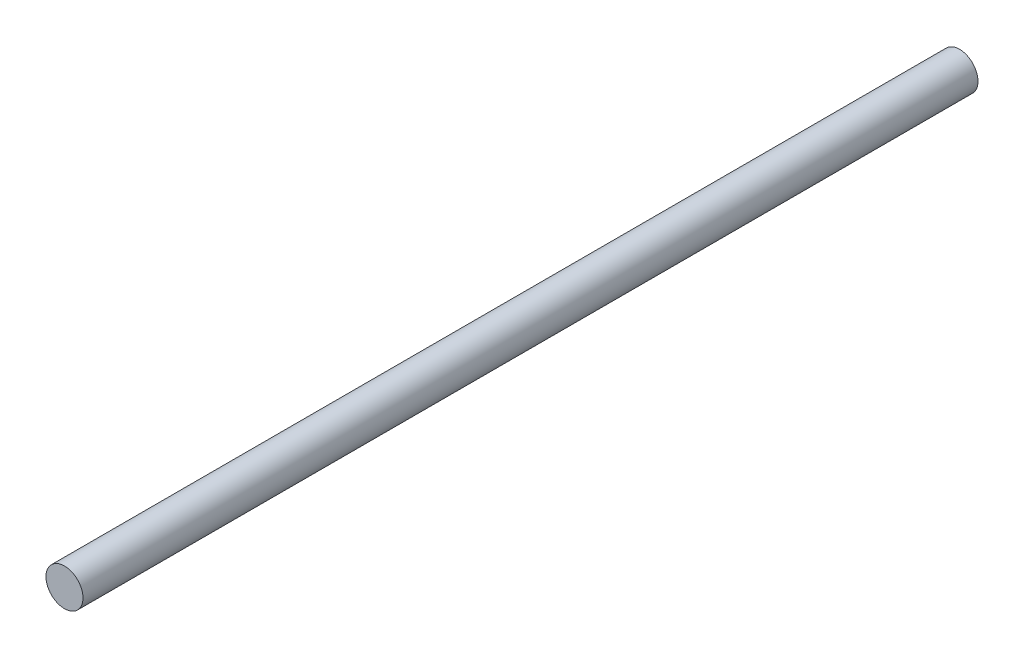
ISO-10303-21;
HEADER;
FILE_DESCRIPTION(('STEP AP214'),'2;1');
FILE_NAME('part.step','',(''),(''),'','','');
FILE_SCHEMA(('AUTOMOTIVE_DESIGN { 1 0 10303 214 1 1 1 1 }'));
ENDSEC;
DATA;
#1=APPLICATION_CONTEXT('core data for automotive mechanical design processes');
#2=APPLICATION_PROTOCOL_DEFINITION('international standard','automotive_design',2000,#1);
#3=PRODUCT_CONTEXT('',#1,'mechanical');
#4=PRODUCT('Part','Part','',(#3));
#5=PRODUCT_RELATED_PRODUCT_CATEGORY('part','',(#4));
#6=PRODUCT_DEFINITION_FORMATION('','',#4);
#7=PRODUCT_DEFINITION_CONTEXT('part definition',#1,'design');
#8=PRODUCT_DEFINITION('design','',#6,#7);
#9=PRODUCT_DEFINITION_SHAPE('','',#8);
#10=(LENGTH_UNIT() NAMED_UNIT(*) SI_UNIT(.MILLI.,.METRE.));
#11=(NAMED_UNIT(*) PLANE_ANGLE_UNIT() SI_UNIT($,.RADIAN.));
#12=(NAMED_UNIT(*) SI_UNIT($,.STERADIAN.) SOLID_ANGLE_UNIT());
#13=UNCERTAINTY_MEASURE_WITH_UNIT(LENGTH_MEASURE(1.E-05),#10,'distance_accuracy_value','');
#14=(GEOMETRIC_REPRESENTATION_CONTEXT(3) GLOBAL_UNCERTAINTY_ASSIGNED_CONTEXT((#13)) GLOBAL_UNIT_ASSIGNED_CONTEXT((#10,
#11,#12)) REPRESENTATION_CONTEXT('',''));
#15=CARTESIAN_POINT('',(0.,0.,0.));
#16=DIRECTION('',(0.,0.,1.));
#17=DIRECTION('',(1.,0.,0.));
#18=AXIS2_PLACEMENT_3D('',#15,#16,#17);
#19=CARTESIAN_POINT('',(0.,0.,145.));
#20=DIRECTION('',(0.,0.,-1.));
#21=DIRECTION('',(-1.,0.,0.));
#22=AXIS2_PLACEMENT_3D('',#19,#20,#21);
#23=CYLINDRICAL_SURFACE('',#22,3.);
#24=CARTESIAN_POINT('',(0.,0.,145.));
#25=DIRECTION('',(0.,0.,1.));
#26=DIRECTION('',(1.,0.,0.));
#27=AXIS2_PLACEMENT_3D('',#24,#25,#26);
#28=CIRCLE('',#27,3.);
#29=CARTESIAN_POINT('',(3.,0.,145.));
#30=VERTEX_POINT('',#29);
#31=EDGE_CURVE('E10',#30,#30,#28,.T.);
#32=ORIENTED_EDGE('',*,*,#31,.F.);
#33=EDGE_LOOP('',(#32));
#34=FACE_BOUND('',#33,.T.);
#35=CARTESIAN_POINT('',(0.,0.,0.));
#36=DIRECTION('',(0.,0.,1.));
#37=DIRECTION('',(1.,0.,0.));
#38=AXIS2_PLACEMENT_3D('',#35,#36,#37);
#39=CIRCLE('',#38,3.);
#40=CARTESIAN_POINT('',(3.,0.,0.));
#41=VERTEX_POINT('',#40);
#42=EDGE_CURVE('E34',#41,#41,#39,.T.);
#43=ORIENTED_EDGE('',*,*,#42,.T.);
#44=EDGE_LOOP('',(#43));
#45=FACE_BOUND('',#44,.T.);
#46=ADVANCED_FACE('F31',(#34,#45),#23,.T.);
#47=CARTESIAN_POINT('',(0.,0.,145.));
#48=DIRECTION('',(0.,0.,1.));
#49=DIRECTION('',(1.,0.,0.));
#50=AXIS2_PLACEMENT_3D('',#47,#48,#49);
#51=PLANE('',#50);
#52=ORIENTED_EDGE('',*,*,#31,.T.);
#53=EDGE_LOOP('',(#52));
#54=FACE_BOUND('',#53,.T.);
#55=ADVANCED_FACE('F46',(#54),#51,.T.);
#56=CARTESIAN_POINT('',(0.,0.,0.));
#57=DIRECTION('',(0.,0.,1.));
#58=DIRECTION('',(1.,0.,0.));
#59=AXIS2_PLACEMENT_3D('',#56,#57,#58);
#60=PLANE('',#59);
#61=ORIENTED_EDGE('',*,*,#42,.F.);
#62=EDGE_LOOP('',(#61));
#63=FACE_BOUND('',#62,.T.);
#64=ADVANCED_FACE('F44',(#63),#60,.F.);
#65=CLOSED_SHELL('',(#46,#55,#64));
#66=MANIFOLD_SOLID_BREP('B2',#65);
#67=ADVANCED_BREP_SHAPE_REPRESENTATION('',(#18,#66),#14);
#68=SHAPE_DEFINITION_REPRESENTATION(#9,#67);
ENDSEC;
END-ISO-10303-21;
